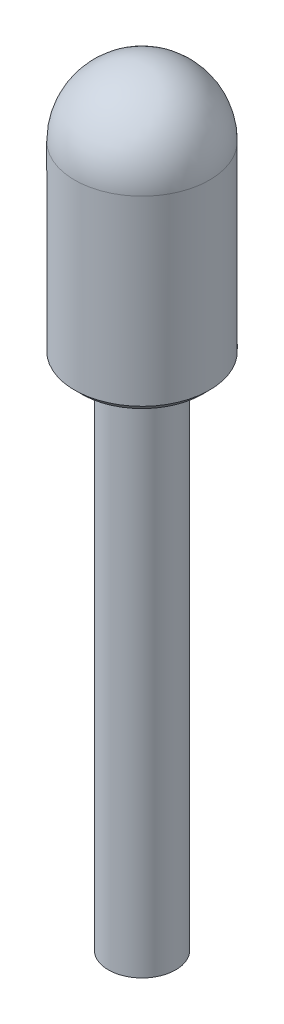
ISO-10303-21;
HEADER;
FILE_DESCRIPTION(('STEP AP214'),'2;1');
FILE_NAME('part.step','',(''),(''),'','','');
FILE_SCHEMA(('AUTOMOTIVE_DESIGN { 1 0 10303 214 1 1 1 1 }'));
ENDSEC;
DATA;
#1=APPLICATION_CONTEXT('core data for automotive mechanical design processes');
#2=APPLICATION_PROTOCOL_DEFINITION('international standard','automotive_design',2000,#1);
#3=PRODUCT_CONTEXT('',#1,'mechanical');
#4=PRODUCT('Part','Part','',(#3));
#5=PRODUCT_RELATED_PRODUCT_CATEGORY('part','',(#4));
#6=PRODUCT_DEFINITION_FORMATION('','',#4);
#7=PRODUCT_DEFINITION_CONTEXT('part definition',#1,'design');
#8=PRODUCT_DEFINITION('design','',#6,#7);
#9=PRODUCT_DEFINITION_SHAPE('','',#8);
#10=(LENGTH_UNIT() NAMED_UNIT(*) SI_UNIT(.MILLI.,.METRE.));
#11=(NAMED_UNIT(*) PLANE_ANGLE_UNIT() SI_UNIT($,.RADIAN.));
#12=(NAMED_UNIT(*) SI_UNIT($,.STERADIAN.) SOLID_ANGLE_UNIT());
#13=UNCERTAINTY_MEASURE_WITH_UNIT(LENGTH_MEASURE(1.E-05),#10,'distance_accuracy_value','');
#14=(GEOMETRIC_REPRESENTATION_CONTEXT(3) GLOBAL_UNCERTAINTY_ASSIGNED_CONTEXT((#13)) GLOBAL_UNIT_ASSIGNED_CONTEXT((#10,
#11,#12)) REPRESENTATION_CONTEXT('',''));
#15=CARTESIAN_POINT('',(0.,0.,0.));
#16=DIRECTION('',(0.,0.,1.));
#17=DIRECTION('',(1.,0.,0.));
#18=AXIS2_PLACEMENT_3D('',#15,#16,#17);
#19=CARTESIAN_POINT('',(0.,0.,0.));
#20=DIRECTION('',(0.,-1.,0.));
#21=DIRECTION('',(0.,0.,-1.));
#22=AXIS2_PLACEMENT_3D('',#19,#20,#21);
#23=PLANE('',#22);
#24=CARTESIAN_POINT('',(0.,0.,0.));
#25=DIRECTION('',(0.,-1.,0.));
#26=DIRECTION('',(0.,0.,-1.));
#27=AXIS2_PLACEMENT_3D('',#24,#25,#26);
#28=CIRCLE('',#27,0.5);
#29=CARTESIAN_POINT('',(0.,0.,-0.5));
#30=VERTEX_POINT('',#29);
#31=EDGE_CURVE('E42',#30,#30,#28,.T.);
#32=ORIENTED_EDGE('',*,*,#31,.T.);
#33=EDGE_LOOP('',(#32));
#34=FACE_BOUND('',#33,.T.);
#35=ADVANCED_FACE('F31',(#34),#23,.T.);
#36=CARTESIAN_POINT('',(0.,0.,0.));
#37=DIRECTION('',(0.,-1.,0.));
#38=DIRECTION('',(0.,0.,-1.));
#39=AXIS2_PLACEMENT_3D('',#36,#37,#38);
#40=CYLINDRICAL_SURFACE('',#39,0.5);
#41=CARTESIAN_POINT('',(0.,7.6,0.));
#42=DIRECTION('',(0.,-1.,0.));
#43=DIRECTION('',(0.,0.,-1.));
#44=AXIS2_PLACEMENT_3D('',#41,#42,#43);
#45=CIRCLE('',#44,0.5);
#46=CARTESIAN_POINT('',(0.,7.6,-0.5));
#47=VERTEX_POINT('',#46);
#48=EDGE_CURVE('E46',#47,#47,#45,.T.);
#49=ORIENTED_EDGE('',*,*,#48,.T.);
#50=EDGE_LOOP('',(#49));
#51=FACE_BOUND('',#50,.T.);
#52=ORIENTED_EDGE('',*,*,#31,.F.);
#53=EDGE_LOOP('',(#52));
#54=FACE_BOUND('',#53,.T.);
#55=ADVANCED_FACE('F68',(#51,#54),#40,.T.);
#56=CARTESIAN_POINT('',(0.5,7.6,0.));
#57=DIRECTION('',(0.,-1.,0.));
#58=DIRECTION('',(0.,0.,-1.));
#59=AXIS2_PLACEMENT_3D('',#56,#57,#58);
#60=PLANE('',#59);
#61=CARTESIAN_POINT('',(0.,7.6,0.));
#62=DIRECTION('',(0.,-1.,0.));
#63=DIRECTION('',(0.,0.,-1.));
#64=AXIS2_PLACEMENT_3D('',#61,#62,#63);
#65=CIRCLE('',#64,0.899999999999998);
#66=CARTESIAN_POINT('',(0.,7.6,-0.899999999999998));
#67=VERTEX_POINT('',#66);
#68=EDGE_CURVE('E38',#67,#67,#65,.T.);
#69=ORIENTED_EDGE('',*,*,#68,.T.);
#70=EDGE_LOOP('',(#69));
#71=FACE_BOUND('',#70,.T.);
#72=ORIENTED_EDGE('',*,*,#48,.F.);
#73=EDGE_LOOP('',(#72));
#74=FACE_BOUND('',#73,.T.);
#75=ADVANCED_FACE('F65',(#71,#74),#60,.T.);
#76=CARTESIAN_POINT('',(0.,0.,0.));
#77=DIRECTION('',(0.,-1.,0.));
#78=DIRECTION('',(0.,0.,-1.));
#79=AXIS2_PLACEMENT_3D('',#76,#77,#78);
#80=CYLINDRICAL_SURFACE('',#79,1.);
#81=CARTESIAN_POINT('',(0.,7.7,0.));
#82=DIRECTION('',(0.,-1.,0.));
#83=DIRECTION('',(0.,0.,-1.));
#84=AXIS2_PLACEMENT_3D('',#81,#82,#83);
#85=CIRCLE('',#84,1.);
#86=CARTESIAN_POINT('',(0.,7.7,-1.));
#87=VERTEX_POINT('',#86);
#88=EDGE_CURVE('E10',#87,#87,#85,.F.);
#89=ORIENTED_EDGE('',*,*,#88,.T.);
#90=EDGE_LOOP('',(#89));
#91=FACE_BOUND('',#90,.T.);
#92=CARTESIAN_POINT('',(0.,10.4,0.));
#93=DIRECTION('',(0.,-1.,0.));
#94=DIRECTION('',(0.,0.,-1.));
#95=AXIS2_PLACEMENT_3D('',#92,#93,#94);
#96=CIRCLE('',#95,1.);
#97=CARTESIAN_POINT('',(0.,10.4,-1.));
#98=VERTEX_POINT('',#97);
#99=EDGE_CURVE('E51',#98,#98,#96,.T.);
#100=ORIENTED_EDGE('',*,*,#99,.T.);
#101=EDGE_LOOP('',(#100));
#102=FACE_BOUND('',#101,.T.);
#103=ADVANCED_FACE('F55',(#91,#102),#80,.T.);
#104=CARTESIAN_POINT('',(0.,10.4,0.));
#105=DIRECTION('',(0.,-1.,0.));
#106=DIRECTION('',(1.,0.,0.));
#107=AXIS2_PLACEMENT_3D('',#104,#105,#106);
#108=SPHERICAL_SURFACE('',#107,1.);
#109=ORIENTED_EDGE('',*,*,#99,.F.);
#110=EDGE_LOOP('',(#109));
#111=FACE_BOUND('',#110,.T.);
#112=ADVANCED_FACE('F57',(#111),#108,.T.);
#113=CARTESIAN_POINT('',(0.,7.6,0.));
#114=DIRECTION('',(0.,1.,0.));
#115=DIRECTION('',(0.,0.,1.));
#116=AXIS2_PLACEMENT_3D('',#113,#114,#115);
#117=CONICAL_SURFACE('',#116,0.899999999999998,0.785398163397448);
#118=ORIENTED_EDGE('',*,*,#88,.F.);
#119=EDGE_LOOP('',(#118));
#120=FACE_BOUND('',#119,.T.);
#121=ORIENTED_EDGE('',*,*,#68,.F.);
#122=EDGE_LOOP('',(#121));
#123=FACE_BOUND('',#122,.T.);
#124=ADVANCED_FACE('F33',(#120,#123),#117,.T.);
#125=CLOSED_SHELL('',(#35,#55,#75,#103,#112,#124));
#126=MANIFOLD_SOLID_BREP('B2',#125);
#127=ADVANCED_BREP_SHAPE_REPRESENTATION('',(#18,#126),#14);
#128=SHAPE_DEFINITION_REPRESENTATION(#9,#127);
ENDSEC;
END-ISO-10303-21;
